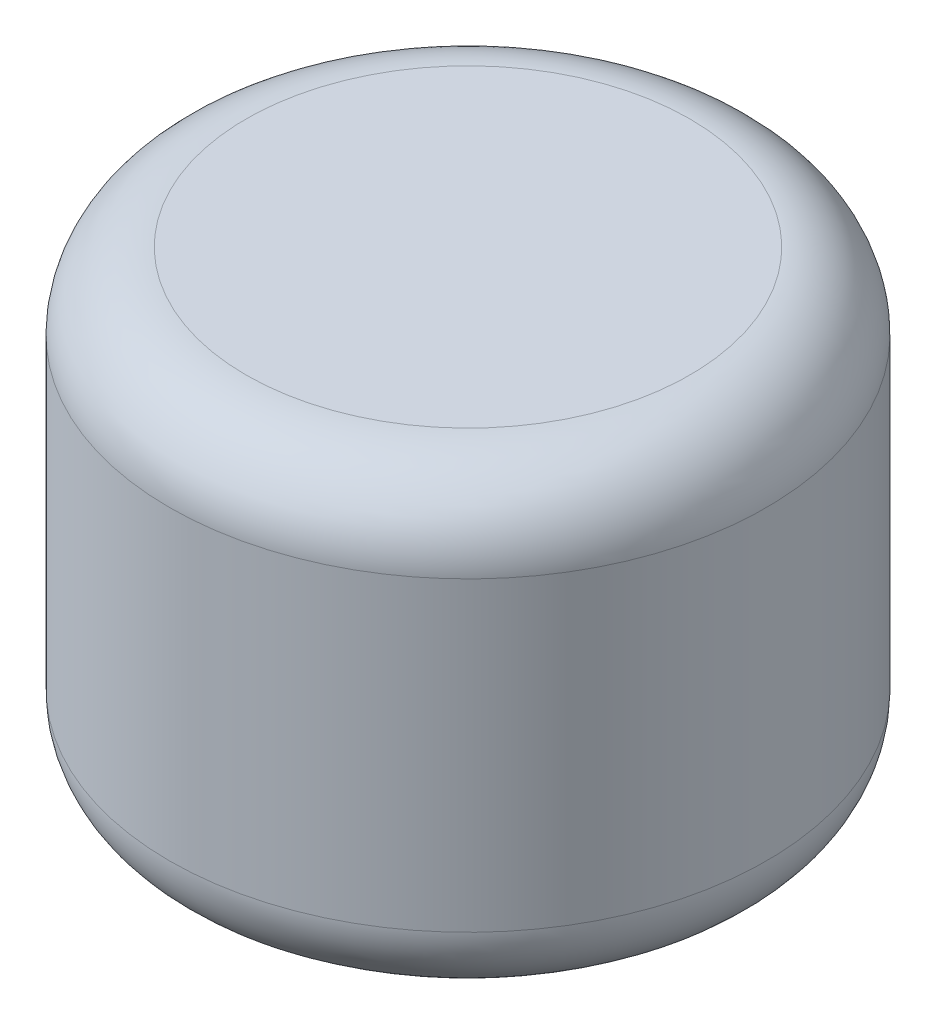
ISO-10303-21;
HEADER;
FILE_DESCRIPTION(('STEP AP214'),'2;1');
FILE_NAME('part.step','',(''),(''),'','','');
FILE_SCHEMA(('AUTOMOTIVE_DESIGN { 1 0 10303 214 1 1 1 1 }'));
ENDSEC;
DATA;
#1=APPLICATION_CONTEXT('core data for automotive mechanical design processes');
#2=APPLICATION_PROTOCOL_DEFINITION('international standard','automotive_design',2000,#1);
#3=PRODUCT_CONTEXT('',#1,'mechanical');
#4=PRODUCT('Part','Part','',(#3));
#5=PRODUCT_RELATED_PRODUCT_CATEGORY('part','',(#4));
#6=PRODUCT_DEFINITION_FORMATION('','',#4);
#7=PRODUCT_DEFINITION_CONTEXT('part definition',#1,'design');
#8=PRODUCT_DEFINITION('design','',#6,#7);
#9=PRODUCT_DEFINITION_SHAPE('','',#8);
#10=(LENGTH_UNIT() NAMED_UNIT(*) SI_UNIT(.MILLI.,.METRE.));
#11=(NAMED_UNIT(*) PLANE_ANGLE_UNIT() SI_UNIT($,.RADIAN.));
#12=(NAMED_UNIT(*) SI_UNIT($,.STERADIAN.) SOLID_ANGLE_UNIT());
#13=UNCERTAINTY_MEASURE_WITH_UNIT(LENGTH_MEASURE(1.E-05),#10,'distance_accuracy_value','');
#14=(GEOMETRIC_REPRESENTATION_CONTEXT(3) GLOBAL_UNCERTAINTY_ASSIGNED_CONTEXT((#13)) GLOBAL_UNIT_ASSIGNED_CONTEXT((#10,
#11,#12)) REPRESENTATION_CONTEXT('',''));
#15=CARTESIAN_POINT('',(0.,0.,0.));
#16=DIRECTION('',(0.,0.,1.));
#17=DIRECTION('',(1.,0.,0.));
#18=AXIS2_PLACEMENT_3D('',#15,#16,#17);
#19=CARTESIAN_POINT('',(0.,76.2,0.));
#20=DIRECTION('',(0.,-1.,0.));
#21=DIRECTION('',(0.,0.,-1.));
#22=AXIS2_PLACEMENT_3D('',#19,#20,#21);
#23=CYLINDRICAL_SURFACE('',#22,49.53);
#24=CARTESIAN_POINT('',(0.,12.7,0.));
#25=DIRECTION('',(0.,1.,0.));
#26=DIRECTION('',(0.,0.,1.));
#27=AXIS2_PLACEMENT_3D('',#24,#25,#26);
#28=CIRCLE('',#27,49.53);
#29=CARTESIAN_POINT('',(0.,12.7,-49.53));
#30=VERTEX_POINT('',#29);
#31=EDGE_CURVE('E48',#30,#30,#28,.T.);
#32=CARTESIAN_POINT('',(0.,63.5,0.));
#33=DIRECTION('',(0.,1.,0.));
#34=DIRECTION('',(0.,0.,1.));
#35=AXIS2_PLACEMENT_3D('',#32,#33,#34);
#36=CIRCLE('',#35,49.53);
#37=CARTESIAN_POINT('',(0.,63.5,-49.53));
#38=VERTEX_POINT('',#37);
#39=EDGE_CURVE('E52',#38,#38,#36,.F.);
#40=CARTESIAN_POINT('',(0.,12.7,-49.53));
#41=CARTESIAN_POINT('',(0.,13.2291666666667,-49.53));
#42=CARTESIAN_POINT('',(0.,13.7583333333333,-49.53));
#43=CARTESIAN_POINT('',(0.,14.8166666666666,-49.53));
#44=CARTESIAN_POINT('',(0.,15.3458333333333,-49.53));
#45=CARTESIAN_POINT('',(0.,16.4041666666666,-49.53));
#46=CARTESIAN_POINT('',(0.,16.9333333333333,-49.53));
#47=CARTESIAN_POINT('',(0.,17.9916666666667,-49.53));
#48=CARTESIAN_POINT('',(0.,18.5208333333333,-49.53));
#49=CARTESIAN_POINT('',(0.,19.5791666666667,-49.53));
#50=CARTESIAN_POINT('',(0.,20.1083333333333,-49.53));
#51=CARTESIAN_POINT('',(0.,21.1666666666667,-49.53));
#52=CARTESIAN_POINT('',(0.,21.6958333333333,-49.53));
#53=CARTESIAN_POINT('',(0.,22.7541666666667,-49.53));
#54=CARTESIAN_POINT('',(0.,23.2833333333333,-49.53));
#55=CARTESIAN_POINT('',(0.,24.3416666666667,-49.53));
#56=CARTESIAN_POINT('',(0.,24.8708333333333,-49.53));
#57=CARTESIAN_POINT('',(0.,25.9291666666667,-49.53));
#58=CARTESIAN_POINT('',(0.,26.4583333333333,-49.53));
#59=CARTESIAN_POINT('',(0.,27.5166666666667,-49.53));
#60=CARTESIAN_POINT('',(0.,28.0458333333333,-49.53));
#61=CARTESIAN_POINT('',(0.,29.1041666666667,-49.53));
#62=CARTESIAN_POINT('',(0.,29.6333333333333,-49.53));
#63=CARTESIAN_POINT('',(0.,30.6916666666667,-49.53));
#64=CARTESIAN_POINT('',(0.,31.2208333333333,-49.53));
#65=CARTESIAN_POINT('',(0.,32.2791666666666,-49.53));
#66=CARTESIAN_POINT('',(0.,32.8083333333333,-49.53));
#67=CARTESIAN_POINT('',(0.,33.8666666666667,-49.53));
#68=CARTESIAN_POINT('',(0.,34.3958333333333,-49.53));
#69=CARTESIAN_POINT('',(0.,35.4541666666667,-49.53));
#70=CARTESIAN_POINT('',(0.,35.9833333333333,-49.53));
#71=CARTESIAN_POINT('',(0.,37.0416666666667,-49.53));
#72=CARTESIAN_POINT('',(0.,37.5708333333333,-49.53));
#73=CARTESIAN_POINT('',(0.,38.6291666666666,-49.53));
#74=CARTESIAN_POINT('',(0.,39.1583333333333,-49.53));
#75=CARTESIAN_POINT('',(0.,40.2166666666666,-49.53));
#76=CARTESIAN_POINT('',(0.,40.7458333333333,-49.53));
#77=CARTESIAN_POINT('',(0.,41.8041666666667,-49.53));
#78=CARTESIAN_POINT('',(0.,42.3333333333333,-49.53));
#79=CARTESIAN_POINT('',(0.,43.3916666666667,-49.53));
#80=CARTESIAN_POINT('',(0.,43.9208333333333,-49.53));
#81=CARTESIAN_POINT('',(0.,44.9791666666667,-49.53));
#82=CARTESIAN_POINT('',(0.,45.5083333333333,-49.53));
#83=CARTESIAN_POINT('',(0.,46.5666666666666,-49.53));
#84=CARTESIAN_POINT('',(0.,47.0958333333333,-49.53));
#85=CARTESIAN_POINT('',(0.,48.1541666666667,-49.53));
#86=CARTESIAN_POINT('',(0.,48.6833333333333,-49.53));
#87=CARTESIAN_POINT('',(0.,49.7416666666667,-49.53));
#88=CARTESIAN_POINT('',(0.,50.2708333333333,-49.53));
#89=CARTESIAN_POINT('',(0.,51.3291666666667,-49.53));
#90=CARTESIAN_POINT('',(0.,51.8583333333333,-49.53));
#91=CARTESIAN_POINT('',(0.,52.9166666666667,-49.53));
#92=CARTESIAN_POINT('',(0.,53.4458333333333,-49.53));
#93=CARTESIAN_POINT('',(0.,54.5041666666666,-49.53));
#94=CARTESIAN_POINT('',(0.,55.0333333333333,-49.53));
#95=CARTESIAN_POINT('',(0.,56.0916666666667,-49.53));
#96=CARTESIAN_POINT('',(0.,56.6208333333333,-49.53));
#97=CARTESIAN_POINT('',(0.,57.6791666666667,-49.53));
#98=CARTESIAN_POINT('',(0.,58.2083333333333,-49.53));
#99=CARTESIAN_POINT('',(0.,59.2666666666667,-49.53));
#100=CARTESIAN_POINT('',(0.,59.7958333333333,-49.53));
#101=CARTESIAN_POINT('',(0.,60.8541666666667,-49.53));
#102=CARTESIAN_POINT('',(0.,61.3833333333333,-49.53));
#103=CARTESIAN_POINT('',(0.,62.4416666666667,-49.53));
#104=CARTESIAN_POINT('',(0.,62.9708333333333,-49.53));
#105=CARTESIAN_POINT('',(0.,63.5,-49.53));
#106=B_SPLINE_CURVE_WITH_KNOTS('',3,(#40,#41,#42,#43,#44,#45,#46,#47,#48,#49,#50,#51,#52,#53,
#54,#55,#56,#57,#58,#59,#60,#61,#62,#63,#64,#65,#66,#67,#68,#69,#70,#71,#72,#73,#74,#75,#76,#77,
#78,#79,#80,#81,#82,#83,#84,#85,#86,#87,#88,#89,#90,#91,#92,#93,#94,#95,#96,#97,#98,#99,#100,
#101,#102,#103,#104,#105),.UNSPECIFIED.,.F.,.F.,(4,2,2,2,2,2,2,2,2,2,2,2,2,2,2,2,2,2,2,2,2,2,2,
2,2,2,2,2,2,2,2,2,4),(0.,1.58749999999999,3.17499999999999,4.7625,6.34999999999999,
7.93749999999999,9.525,11.1125,12.7,14.2875,15.875,17.4625,19.05,20.6375,22.225,23.8125,25.4,
26.9875,28.575,30.1625,31.75,33.3375,34.925,36.5125,38.1,39.6875,41.275,42.8625,44.45,46.0375,
47.625,49.2125,50.8),.UNSPECIFIED.);
#107=EDGE_CURVE('BSEAM37',#30,#38,#106,.T.);
#108=ORIENTED_EDGE('',*,*,#31,.T.);
#109=ORIENTED_EDGE('',*,*,#39,.T.);
#110=ORIENTED_EDGE('',*,*,#107,.T.);
#111=ORIENTED_EDGE('',*,*,#107,.F.);
#112=EDGE_LOOP('',(#108,#110,#109,#111));
#113=FACE_BOUND('',#112,.T.);
#114=ADVANCED_FACE('F37',(#113),#23,.T.);
#115=CARTESIAN_POINT('',(0.,76.2,0.));
#116=DIRECTION('',(0.,1.,0.));
#117=DIRECTION('',(0.,0.,1.));
#118=AXIS2_PLACEMENT_3D('',#115,#116,#117);
#119=PLANE('',#118);
#120=CARTESIAN_POINT('',(0.,76.2,0.));
#121=DIRECTION('',(0.,1.,0.));
#122=DIRECTION('',(0.,0.,1.));
#123=AXIS2_PLACEMENT_3D('',#120,#121,#122);
#124=CIRCLE('',#123,36.83);
#125=CARTESIAN_POINT('',(0.,76.2,36.83));
#126=VERTEX_POINT('',#125);
#127=EDGE_CURVE('E10',#126,#126,#124,.T.);
#128=ORIENTED_EDGE('',*,*,#127,.T.);
#129=EDGE_LOOP('',(#128));
#130=FACE_BOUND('',#129,.T.);
#131=ADVANCED_FACE('F68',(#130),#119,.T.);
#132=CARTESIAN_POINT('',(0.,0.,0.));
#133=DIRECTION('',(0.,1.,0.));
#134=DIRECTION('',(0.,0.,1.));
#135=AXIS2_PLACEMENT_3D('',#132,#133,#134);
#136=PLANE('',#135);
#137=CARTESIAN_POINT('',(0.,0.,0.));
#138=DIRECTION('',(0.,1.,0.));
#139=DIRECTION('',(0.,0.,1.));
#140=AXIS2_PLACEMENT_3D('',#137,#138,#139);
#141=CIRCLE('',#140,36.83);
#142=CARTESIAN_POINT('',(0.,0.,36.83));
#143=VERTEX_POINT('',#142);
#144=EDGE_CURVE('E44',#143,#143,#141,.F.);
#145=ORIENTED_EDGE('',*,*,#144,.T.);
#146=EDGE_LOOP('',(#145));
#147=FACE_BOUND('',#146,.T.);
#148=ADVANCED_FACE('F65',(#147),#136,.F.);
#149=CARTESIAN_POINT('',(0.,12.7,0.));
#150=DIRECTION('',(0.,1.,0.));
#151=DIRECTION('',(0.,0.,1.));
#152=AXIS2_PLACEMENT_3D('',#149,#150,#151);
#153=TOROIDAL_SURFACE('',#152,36.83,12.7);
#154=ORIENTED_EDGE('',*,*,#144,.F.);
#155=EDGE_LOOP('',(#154));
#156=FACE_BOUND('',#155,.T.);
#157=ORIENTED_EDGE('',*,*,#31,.F.);
#158=EDGE_LOOP('',(#157));
#159=FACE_BOUND('',#158,.T.);
#160=ADVANCED_FACE('F61',(#156,#159),#153,.T.);
#161=CARTESIAN_POINT('',(0.,63.5,0.));
#162=DIRECTION('',(0.,1.,0.));
#163=DIRECTION('',(0.,0.,1.));
#164=AXIS2_PLACEMENT_3D('',#161,#162,#163);
#165=TOROIDAL_SURFACE('',#164,36.83,12.7);
#166=ORIENTED_EDGE('',*,*,#39,.F.);
#167=EDGE_LOOP('',(#166));
#168=FACE_BOUND('',#167,.T.);
#169=ORIENTED_EDGE('',*,*,#127,.F.);
#170=EDGE_LOOP('',(#169));
#171=FACE_BOUND('',#170,.T.);
#172=ADVANCED_FACE('F39',(#168,#171),#165,.T.);
#173=CLOSED_SHELL('',(#114,#131,#148,#160,#172));
#174=MANIFOLD_SOLID_BREP('B2',#173);
#175=ADVANCED_BREP_SHAPE_REPRESENTATION('',(#18,#174),#14);
#176=SHAPE_DEFINITION_REPRESENTATION(#9,#175);
ENDSEC;
END-ISO-10303-21;
